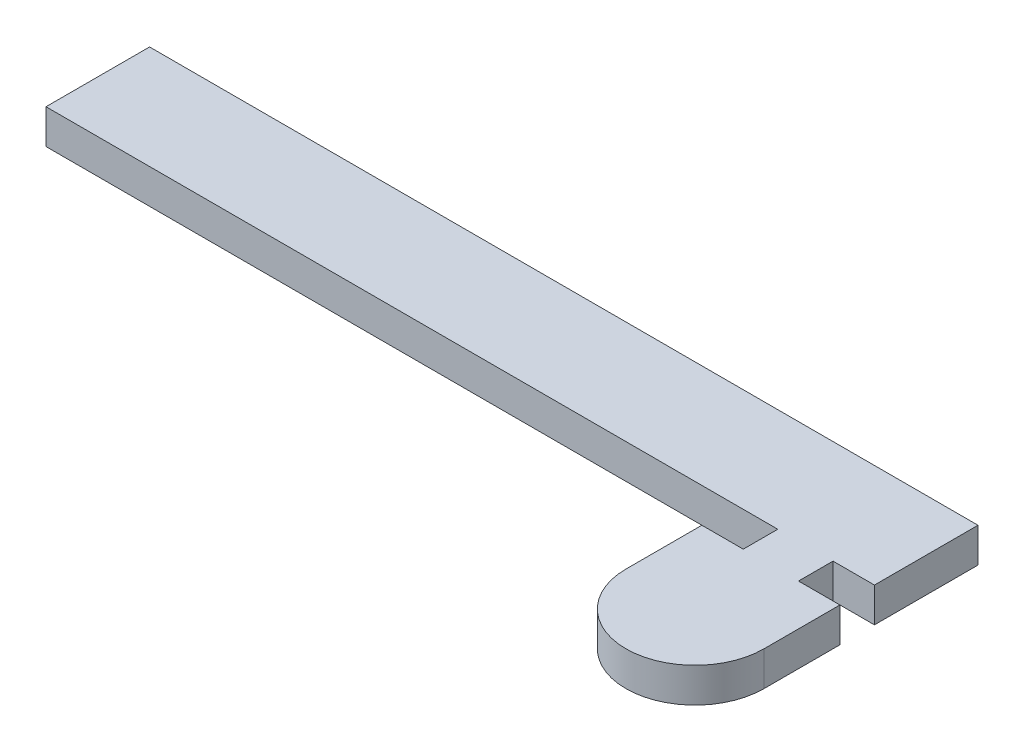
ISO-10303-21;
HEADER;
FILE_DESCRIPTION(('STEP AP214'),'2;1');
FILE_NAME('part.step','',(''),(''),'','','');
FILE_SCHEMA(('AUTOMOTIVE_DESIGN { 1 0 10303 214 1 1 1 1 }'));
ENDSEC;
DATA;
#1=APPLICATION_CONTEXT('core data for automotive mechanical design processes');
#2=APPLICATION_PROTOCOL_DEFINITION('international standard','automotive_design',2000,#1);
#3=PRODUCT_CONTEXT('',#1,'mechanical');
#4=PRODUCT('Part','Part','',(#3));
#5=PRODUCT_RELATED_PRODUCT_CATEGORY('part','',(#4));
#6=PRODUCT_DEFINITION_FORMATION('','',#4);
#7=PRODUCT_DEFINITION_CONTEXT('part definition',#1,'design');
#8=PRODUCT_DEFINITION('design','',#6,#7);
#9=PRODUCT_DEFINITION_SHAPE('','',#8);
#10=(LENGTH_UNIT() NAMED_UNIT(*) SI_UNIT(.MILLI.,.METRE.));
#11=(NAMED_UNIT(*) PLANE_ANGLE_UNIT() SI_UNIT($,.RADIAN.));
#12=(NAMED_UNIT(*) SI_UNIT($,.STERADIAN.) SOLID_ANGLE_UNIT());
#13=UNCERTAINTY_MEASURE_WITH_UNIT(LENGTH_MEASURE(1.E-05),#10,'distance_accuracy_value','');
#14=(GEOMETRIC_REPRESENTATION_CONTEXT(3) GLOBAL_UNCERTAINTY_ASSIGNED_CONTEXT((#13)) GLOBAL_UNIT_ASSIGNED_CONTEXT((#10,
#11,#12)) REPRESENTATION_CONTEXT('',''));
#15=CARTESIAN_POINT('',(0.,0.,0.));
#16=DIRECTION('',(0.,0.,1.));
#17=DIRECTION('',(1.,0.,0.));
#18=AXIS2_PLACEMENT_3D('',#15,#16,#17);
#19=CARTESIAN_POINT('',(-37.8392780705383,5.,0.));
#20=DIRECTION('',(1.,0.,0.));
#21=DIRECTION('',(0.,0.,-1.));
#22=AXIS2_PLACEMENT_3D('',#19,#20,#21);
#23=PLANE('',#22);
#24=DIRECTION('',(0.,0.,1.));
#25=VECTOR('',#24,1.);
#26=CARTESIAN_POINT('',(-37.8392780705383,5.,0.));
#27=LINE('',#26,#25);
#28=CARTESIAN_POINT('',(-37.8392780705383,5.,10.269009949861));
#29=VERTEX_POINT('',#28);
#30=CARTESIAN_POINT('',(-37.8392780705383,5.,21.269009949861));
#31=VERTEX_POINT('',#30);
#32=EDGE_CURVE('E190',#29,#31,#27,.T.);
#33=ORIENTED_EDGE('',*,*,#32,.F.);
#34=DIRECTION('',(0.,1.,0.));
#35=VECTOR('',#34,1.);
#36=CARTESIAN_POINT('',(-37.8392780705383,-5.,10.269009949861));
#37=LINE('',#36,#35);
#38=CARTESIAN_POINT('',(-37.8392780705383,0.,10.269009949861));
#39=VERTEX_POINT('',#38);
#40=EDGE_CURVE('E183',#39,#29,#37,.T.);
#41=ORIENTED_EDGE('',*,*,#40,.F.);
#42=DIRECTION('',(0.,0.,1.));
#43=VECTOR('',#42,1.);
#44=CARTESIAN_POINT('',(-37.8392780705383,0.,0.));
#45=LINE('',#44,#43);
#46=CARTESIAN_POINT('',(-37.8392780705383,0.,21.269009949861));
#47=VERTEX_POINT('',#46);
#48=EDGE_CURVE('E187',#39,#47,#45,.T.);
#49=ORIENTED_EDGE('',*,*,#48,.T.);
#50=DIRECTION('',(0.,-1.,0.));
#51=VECTOR('',#50,1.);
#52=CARTESIAN_POINT('',(-37.8392780705383,5.,21.269009949861));
#53=LINE('',#52,#51);
#54=EDGE_CURVE('E206',#31,#47,#53,.T.);
#55=ORIENTED_EDGE('',*,*,#54,.F.);
#56=EDGE_LOOP('',(#33,#41,#49,#55));
#57=FACE_BOUND('',#56,.T.);
#58=ADVANCED_FACE('F35',(#57),#23,.F.);
#59=CARTESIAN_POINT('',(-27.8392780705383,5.,21.269009949861));
#60=DIRECTION('',(0.,-1.,0.));
#61=DIRECTION('',(0.,0.,-1.));
#62=AXIS2_PLACEMENT_3D('',#59,#60,#61);
#63=CYLINDRICAL_SURFACE('',#62,10.);
#64=CARTESIAN_POINT('',(-27.8392780705383,0.,21.269009949861));
#65=DIRECTION('',(0.,1.,0.));
#66=DIRECTION('',(0.,0.,1.));
#67=AXIS2_PLACEMENT_3D('',#64,#65,#66);
#68=CIRCLE('',#67,10.);
#69=CARTESIAN_POINT('',(-17.8392780705383,0.,21.269009949861));
#70=VERTEX_POINT('',#69);
#71=EDGE_CURVE('E200',#47,#70,#68,.T.);
#72=ORIENTED_EDGE('',*,*,#71,.T.);
#73=DIRECTION('',(0.,-1.,0.));
#74=VECTOR('',#73,1.);
#75=CARTESIAN_POINT('',(-17.8392780705383,5.,21.269009949861));
#76=LINE('',#75,#74);
#77=CARTESIAN_POINT('',(-17.8392780705383,5.,21.269009949861));
#78=VERTEX_POINT('',#77);
#79=EDGE_CURVE('E198',#78,#70,#76,.T.);
#80=ORIENTED_EDGE('',*,*,#79,.F.);
#81=CARTESIAN_POINT('',(-27.8392780705383,5.,21.269009949861));
#82=DIRECTION('',(0.,1.,0.));
#83=DIRECTION('',(0.,0.,1.));
#84=AXIS2_PLACEMENT_3D('',#81,#82,#83);
#85=CIRCLE('',#84,10.);
#86=EDGE_CURVE('E192',#31,#78,#85,.T.);
#87=ORIENTED_EDGE('',*,*,#86,.F.);
#88=ORIENTED_EDGE('',*,*,#54,.T.);
#89=EDGE_LOOP('',(#72,#80,#87,#88));
#90=FACE_BOUND('',#89,.T.);
#91=ADVANCED_FACE('F235',(#90),#63,.T.);
#92=CARTESIAN_POINT('',(-17.8392780705383,5.,0.));
#93=DIRECTION('',(1.,0.,0.));
#94=DIRECTION('',(0.,0.,-1.));
#95=AXIS2_PLACEMENT_3D('',#92,#93,#94);
#96=PLANE('',#95);
#97=DIRECTION('',(0.,1.,0.));
#98=VECTOR('',#97,1.);
#99=CARTESIAN_POINT('',(-17.8392780705383,-5.,10.269009949861));
#100=LINE('',#99,#98);
#101=CARTESIAN_POINT('',(-17.8392780705383,0.,10.269009949861));
#102=VERTEX_POINT('',#101);
#103=CARTESIAN_POINT('',(-17.8392780705383,5.,10.269009949861));
#104=VERTEX_POINT('',#103);
#105=EDGE_CURVE('E174',#102,#104,#100,.T.);
#106=ORIENTED_EDGE('',*,*,#105,.T.);
#107=DIRECTION('',(0.,0.,1.));
#108=VECTOR('',#107,1.);
#109=CARTESIAN_POINT('',(-17.8392780705383,5.,0.));
#110=LINE('',#109,#108);
#111=EDGE_CURVE('E196',#104,#78,#110,.T.);
#112=ORIENTED_EDGE('',*,*,#111,.T.);
#113=ORIENTED_EDGE('',*,*,#79,.T.);
#114=DIRECTION('',(0.,0.,1.));
#115=VECTOR('',#114,1.);
#116=CARTESIAN_POINT('',(-17.8392780705383,0.,0.));
#117=LINE('',#116,#115);
#118=EDGE_CURVE('E193',#102,#70,#117,.T.);
#119=ORIENTED_EDGE('',*,*,#118,.F.);
#120=EDGE_LOOP('',(#106,#112,#113,#119));
#121=FACE_BOUND('',#120,.T.);
#122=ADVANCED_FACE('F228',(#121),#96,.T.);
#123=CARTESIAN_POINT('',(0.,5.,0.));
#124=DIRECTION('',(0.,1.,0.));
#125=DIRECTION('',(0.,0.,1.));
#126=AXIS2_PLACEMENT_3D('',#123,#124,#125);
#127=PLANE('',#126);
#128=DIRECTION('',(1.,0.,0.));
#129=VECTOR('',#128,1.);
#130=CARTESIAN_POINT('',(-17.8392780705383,5.,10.269009949861));
#131=LINE('',#130,#129);
#132=CARTESIAN_POINT('',(-23.8392780705383,5.,10.269009949861));
#133=VERTEX_POINT('',#132);
#134=EDGE_CURVE('E171',#133,#104,#131,.T.);
#135=ORIENTED_EDGE('',*,*,#134,.F.);
#136=DIRECTION('',(0.,0.,1.));
#137=VECTOR('',#136,1.);
#138=CARTESIAN_POINT('',(-23.8392780705383,5.,5.26900994986101));
#139=LINE('',#138,#137);
#140=CARTESIAN_POINT('',(-23.8392780705383,5.,5.26900994986101));
#141=VERTEX_POINT('',#140);
#142=EDGE_CURVE('E165',#141,#133,#139,.T.);
#143=ORIENTED_EDGE('',*,*,#142,.F.);
#144=DIRECTION('',(-1.,0.,0.));
#145=VECTOR('',#144,1.);
#146=CARTESIAN_POINT('',(-17.8392780705383,5.,5.26900994986101));
#147=LINE('',#146,#145);
#148=CARTESIAN_POINT('',(-17.8392780705383,5.,5.26900994986101));
#149=VERTEX_POINT('',#148);
#150=EDGE_CURVE('E149',#149,#141,#147,.T.);
#151=ORIENTED_EDGE('',*,*,#150,.F.);
#152=DIRECTION('',(0.,0.,-1.));
#153=VECTOR('',#152,1.);
#154=CARTESIAN_POINT('',(-17.8392780705383,5.,5.26900994986101));
#155=LINE('',#154,#153);
#156=CARTESIAN_POINT('',(-17.8392780705383,5.,-9.73099005013899));
#157=VERTEX_POINT('',#156);
#158=EDGE_CURVE('E158',#149,#157,#155,.T.);
#159=ORIENTED_EDGE('',*,*,#158,.T.);
#160=DIRECTION('',(-1.,0.,0.));
#161=VECTOR('',#160,1.);
#162=CARTESIAN_POINT('',(-17.8392780705383,5.,-9.73099005013899));
#163=LINE('',#162,#161);
#164=CARTESIAN_POINT('',(-137.839278070538,5.,-9.73099005013897));
#165=VERTEX_POINT('',#164);
#166=EDGE_CURVE('E128',#157,#165,#163,.T.);
#167=ORIENTED_EDGE('',*,*,#166,.T.);
#168=DIRECTION('',(0.,0.,1.));
#169=VECTOR('',#168,1.);
#170=CARTESIAN_POINT('',(-137.839278070538,5.,-9.73099005013897));
#171=LINE('',#170,#169);
#172=CARTESIAN_POINT('',(-137.839278070538,5.,5.26900994986103));
#173=VERTEX_POINT('',#172);
#174=EDGE_CURVE('E161',#165,#173,#171,.T.);
#175=ORIENTED_EDGE('',*,*,#174,.T.);
#176=CARTESIAN_POINT('',(-31.8392780705383,5.,5.26900994986101));
#177=VERTEX_POINT('',#176);
#178=EDGE_CURVE('E152',#177,#173,#147,.T.);
#179=ORIENTED_EDGE('',*,*,#178,.F.);
#180=DIRECTION('',(0.,0.,-1.));
#181=VECTOR('',#180,1.);
#182=CARTESIAN_POINT('',(-31.8392780705383,5.,5.26900994986102));
#183=LINE('',#182,#181);
#184=CARTESIAN_POINT('',(-31.8392780705383,5.,10.269009949861));
#185=VERTEX_POINT('',#184);
#186=EDGE_CURVE('E181',#185,#177,#183,.T.);
#187=ORIENTED_EDGE('',*,*,#186,.F.);
#188=DIRECTION('',(1.,0.,0.));
#189=VECTOR('',#188,1.);
#190=CARTESIAN_POINT('',(-37.8392780705383,5.,10.269009949861));
#191=LINE('',#190,#189);
#192=EDGE_CURVE('E177',#29,#185,#191,.T.);
#193=ORIENTED_EDGE('',*,*,#192,.F.);
#194=ORIENTED_EDGE('',*,*,#32,.T.);
#195=ORIENTED_EDGE('',*,*,#86,.T.);
#196=ORIENTED_EDGE('',*,*,#111,.F.);
#197=EDGE_LOOP('',(#135,#143,#151,#159,#167,#175,#179,#187,#193,#194,#195,#196));
#198=FACE_BOUND('',#197,.T.);
#199=ADVANCED_FACE('F223',(#198),#127,.T.);
#200=CARTESIAN_POINT('',(0.,0.,0.));
#201=DIRECTION('',(0.,1.,0.));
#202=DIRECTION('',(0.,0.,1.));
#203=AXIS2_PLACEMENT_3D('',#200,#201,#202);
#204=PLANE('',#203);
#205=DIRECTION('',(0.,0.,1.));
#206=VECTOR('',#205,1.);
#207=CARTESIAN_POINT('',(-23.8392780705383,0.,0.));
#208=LINE('',#207,#206);
#209=CARTESIAN_POINT('',(-23.8392780705383,0.,5.26900994986101));
#210=VERTEX_POINT('',#209);
#211=CARTESIAN_POINT('',(-23.8392780705383,0.,10.269009949861));
#212=VERTEX_POINT('',#211);
#213=EDGE_CURVE('E42',#210,#212,#208,.T.);
#214=ORIENTED_EDGE('',*,*,#213,.T.);
#215=DIRECTION('',(1.,0.,0.));
#216=VECTOR('',#215,1.);
#217=CARTESIAN_POINT('',(0.,0.,10.269009949861));
#218=LINE('',#217,#216);
#219=EDGE_CURVE('E11',#212,#102,#218,.T.);
#220=ORIENTED_EDGE('',*,*,#219,.T.);
#221=ORIENTED_EDGE('',*,*,#118,.T.);
#222=ORIENTED_EDGE('',*,*,#71,.F.);
#223=ORIENTED_EDGE('',*,*,#48,.F.);
#224=DIRECTION('',(1.,0.,0.));
#225=VECTOR('',#224,1.);
#226=CARTESIAN_POINT('',(0.,0.,10.269009949861));
#227=LINE('',#226,#225);
#228=CARTESIAN_POINT('',(-31.8392780705383,0.,10.269009949861));
#229=VERTEX_POINT('',#228);
#230=EDGE_CURVE('E209',#39,#229,#227,.T.);
#231=ORIENTED_EDGE('',*,*,#230,.T.);
#232=DIRECTION('',(0.,0.,-1.));
#233=VECTOR('',#232,1.);
#234=CARTESIAN_POINT('',(-31.8392780705383,0.,0.));
#235=LINE('',#234,#233);
#236=CARTESIAN_POINT('',(-31.8392780705383,0.,5.26900994986102));
#237=VERTEX_POINT('',#236);
#238=EDGE_CURVE('E212',#229,#237,#235,.T.);
#239=ORIENTED_EDGE('',*,*,#238,.T.);
#240=DIRECTION('',(-1.,0.,0.));
#241=VECTOR('',#240,1.);
#242=CARTESIAN_POINT('',(-17.8392780705383,0.,5.26900994986101));
#243=LINE('',#242,#241);
#244=CARTESIAN_POINT('',(-137.839278070538,0.,5.26900994986103));
#245=VERTEX_POINT('',#244);
#246=EDGE_CURVE('E156',#237,#245,#243,.T.);
#247=ORIENTED_EDGE('',*,*,#246,.T.);
#248=DIRECTION('',(0.,0.,1.));
#249=VECTOR('',#248,1.);
#250=CARTESIAN_POINT('',(-137.839278070538,0.,-9.73099005013897));
#251=LINE('',#250,#249);
#252=CARTESIAN_POINT('',(-137.839278070538,0.,-9.73099005013897));
#253=VERTEX_POINT('',#252);
#254=EDGE_CURVE('E144',#253,#245,#251,.T.);
#255=ORIENTED_EDGE('',*,*,#254,.F.);
#256=DIRECTION('',(-1.,0.,0.));
#257=VECTOR('',#256,1.);
#258=CARTESIAN_POINT('',(-17.8392780705383,0.,-9.73099005013899));
#259=LINE('',#258,#257);
#260=CARTESIAN_POINT('',(-17.8392780705383,0.,-9.73099005013899));
#261=VERTEX_POINT('',#260);
#262=EDGE_CURVE('E126',#261,#253,#259,.T.);
#263=ORIENTED_EDGE('',*,*,#262,.F.);
#264=DIRECTION('',(0.,0.,-1.));
#265=VECTOR('',#264,1.);
#266=CARTESIAN_POINT('',(-17.8392780705383,0.,5.26900994986101));
#267=LINE('',#266,#265);
#268=CARTESIAN_POINT('',(-17.8392780705383,0.,5.26900994986101));
#269=VERTEX_POINT('',#268);
#270=EDGE_CURVE('E142',#269,#261,#267,.T.);
#271=ORIENTED_EDGE('',*,*,#270,.F.);
#272=EDGE_CURVE('E134',#269,#210,#243,.T.);
#273=ORIENTED_EDGE('',*,*,#272,.T.);
#274=EDGE_LOOP('',(#214,#220,#221,#222,#223,#231,#239,#247,#255,#263,#271,#273));
#275=FACE_BOUND('',#274,.T.);
#276=ADVANCED_FACE('F140',(#275),#204,.F.);
#277=CARTESIAN_POINT('',(-31.8392780705383,-5.,5.26900994986102));
#278=DIRECTION('',(1.,0.,0.));
#279=DIRECTION('',(0.,0.,-1.));
#280=AXIS2_PLACEMENT_3D('',#277,#278,#279);
#281=PLANE('',#280);
#282=DIRECTION('',(0.,1.,0.));
#283=VECTOR('',#282,1.);
#284=CARTESIAN_POINT('',(-31.8392780705383,-5.,10.269009949861));
#285=LINE('',#284,#283);
#286=EDGE_CURVE('E57',#229,#185,#285,.T.);
#287=ORIENTED_EDGE('',*,*,#286,.T.);
#288=ORIENTED_EDGE('',*,*,#186,.T.);
#289=DIRECTION('',(0.,1.,0.));
#290=VECTOR('',#289,1.);
#291=CARTESIAN_POINT('',(-31.8392780705383,-5.,5.26900994986102));
#292=LINE('',#291,#290);
#293=EDGE_CURVE('E184',#237,#177,#292,.T.);
#294=ORIENTED_EDGE('',*,*,#293,.F.);
#295=ORIENTED_EDGE('',*,*,#238,.F.);
#296=EDGE_LOOP('',(#287,#288,#294,#295));
#297=FACE_BOUND('',#296,.T.);
#298=ADVANCED_FACE('F244',(#297),#281,.F.);
#299=CARTESIAN_POINT('',(-37.8392780705383,-5.,10.269009949861));
#300=DIRECTION('',(0.,0.,1.));
#301=DIRECTION('',(1.,0.,0.));
#302=AXIS2_PLACEMENT_3D('',#299,#300,#301);
#303=PLANE('',#302);
#304=ORIENTED_EDGE('',*,*,#40,.T.);
#305=ORIENTED_EDGE('',*,*,#192,.T.);
#306=ORIENTED_EDGE('',*,*,#286,.F.);
#307=ORIENTED_EDGE('',*,*,#230,.F.);
#308=EDGE_LOOP('',(#304,#305,#306,#307));
#309=FACE_BOUND('',#308,.T.);
#310=ADVANCED_FACE('F240',(#309),#303,.F.);
#311=CARTESIAN_POINT('',(-17.8392780705383,-5.,10.269009949861));
#312=DIRECTION('',(0.,0.,1.));
#313=DIRECTION('',(1.,0.,0.));
#314=AXIS2_PLACEMENT_3D('',#311,#312,#313);
#315=PLANE('',#314);
#316=DIRECTION('',(0.,1.,0.));
#317=VECTOR('',#316,1.);
#318=CARTESIAN_POINT('',(-23.8392780705383,-5.,10.269009949861));
#319=LINE('',#318,#317);
#320=EDGE_CURVE('E49',#212,#133,#319,.T.);
#321=ORIENTED_EDGE('',*,*,#320,.T.);
#322=ORIENTED_EDGE('',*,*,#134,.T.);
#323=ORIENTED_EDGE('',*,*,#105,.F.);
#324=ORIENTED_EDGE('',*,*,#219,.F.);
#325=EDGE_LOOP('',(#321,#322,#323,#324));
#326=FACE_BOUND('',#325,.T.);
#327=ADVANCED_FACE('F226',(#326),#315,.F.);
#328=CARTESIAN_POINT('',(-23.8392780705383,-5.,5.26900994986101));
#329=DIRECTION('',(-1.,0.,0.));
#330=DIRECTION('',(0.,0.,1.));
#331=AXIS2_PLACEMENT_3D('',#328,#329,#330);
#332=PLANE('',#331);
#333=DIRECTION('',(0.,1.,0.));
#334=VECTOR('',#333,1.);
#335=CARTESIAN_POINT('',(-23.8392780705383,-5.,5.26900994986101));
#336=LINE('',#335,#334);
#337=EDGE_CURVE('E173',#210,#141,#336,.T.);
#338=ORIENTED_EDGE('',*,*,#337,.T.);
#339=ORIENTED_EDGE('',*,*,#142,.T.);
#340=ORIENTED_EDGE('',*,*,#320,.F.);
#341=ORIENTED_EDGE('',*,*,#213,.F.);
#342=EDGE_LOOP('',(#338,#339,#340,#341));
#343=FACE_BOUND('',#342,.T.);
#344=ADVANCED_FACE('F216',(#343),#332,.F.);
#345=CARTESIAN_POINT('',(-17.8392780705383,0.,5.26900994986101));
#346=DIRECTION('',(0.,0.,-1.));
#347=DIRECTION('',(-1.,0.,0.));
#348=AXIS2_PLACEMENT_3D('',#345,#346,#347);
#349=PLANE('',#348);
#350=ORIENTED_EDGE('',*,*,#246,.F.);
#351=ORIENTED_EDGE('',*,*,#293,.T.);
#352=ORIENTED_EDGE('',*,*,#178,.T.);
#353=DIRECTION('',(0.,1.,0.));
#354=VECTOR('',#353,1.);
#355=CARTESIAN_POINT('',(-137.839278070538,0.,5.26900994986103));
#356=LINE('',#355,#354);
#357=EDGE_CURVE('E166',#245,#173,#356,.T.);
#358=ORIENTED_EDGE('',*,*,#357,.F.);
#359=EDGE_LOOP('',(#350,#351,#352,#358));
#360=FACE_BOUND('',#359,.T.);
#361=ADVANCED_FACE('F247',(#360),#349,.F.);
#362=CARTESIAN_POINT('',(-17.8392780705383,0.,5.26900994986101));
#363=DIRECTION('',(1.,0.,0.));
#364=DIRECTION('',(0.,0.,-1.));
#365=AXIS2_PLACEMENT_3D('',#362,#363,#364);
#366=PLANE('',#365);
#367=ORIENTED_EDGE('',*,*,#158,.F.);
#368=DIRECTION('',(0.,1.,0.));
#369=VECTOR('',#368,1.);
#370=CARTESIAN_POINT('',(-17.8392780705383,0.,5.26900994986101));
#371=LINE('',#370,#369);
#372=EDGE_CURVE('E147',#269,#149,#371,.T.);
#373=ORIENTED_EDGE('',*,*,#372,.F.);
#374=ORIENTED_EDGE('',*,*,#270,.T.);
#375=DIRECTION('',(0.,1.,0.));
#376=VECTOR('',#375,1.);
#377=CARTESIAN_POINT('',(-17.8392780705383,0.,-9.73099005013899));
#378=LINE('',#377,#376);
#379=EDGE_CURVE('E123',#261,#157,#378,.T.);
#380=ORIENTED_EDGE('',*,*,#379,.T.);
#381=EDGE_LOOP('',(#367,#373,#374,#380));
#382=FACE_BOUND('',#381,.T.);
#383=ADVANCED_FACE('F146',(#382),#366,.T.);
#384=ORIENTED_EDGE('',*,*,#337,.F.);
#385=ORIENTED_EDGE('',*,*,#272,.F.);
#386=ORIENTED_EDGE('',*,*,#372,.T.);
#387=ORIENTED_EDGE('',*,*,#150,.T.);
#388=EDGE_LOOP('',(#384,#385,#386,#387));
#389=FACE_BOUND('',#388,.T.);
#390=ADVANCED_FACE('F219',(#389),#349,.F.);
#391=CARTESIAN_POINT('',(-137.839278070538,0.,-9.73099005013897));
#392=DIRECTION('',(-1.,0.,0.));
#393=DIRECTION('',(0.,0.,1.));
#394=AXIS2_PLACEMENT_3D('',#391,#392,#393);
#395=PLANE('',#394);
#396=ORIENTED_EDGE('',*,*,#174,.F.);
#397=DIRECTION('',(0.,1.,0.));
#398=VECTOR('',#397,1.);
#399=CARTESIAN_POINT('',(-137.839278070538,0.,-9.73099005013897));
#400=LINE('',#399,#398);
#401=EDGE_CURVE('E133',#253,#165,#400,.T.);
#402=ORIENTED_EDGE('',*,*,#401,.F.);
#403=ORIENTED_EDGE('',*,*,#254,.T.);
#404=ORIENTED_EDGE('',*,*,#357,.T.);
#405=EDGE_LOOP('',(#396,#402,#403,#404));
#406=FACE_BOUND('',#405,.T.);
#407=ADVANCED_FACE('F251',(#406),#395,.T.);
#408=CARTESIAN_POINT('',(-17.8392780705383,0.,-9.73099005013899));
#409=DIRECTION('',(0.,0.,-1.));
#410=DIRECTION('',(-1.,0.,0.));
#411=AXIS2_PLACEMENT_3D('',#408,#409,#410);
#412=PLANE('',#411);
#413=ORIENTED_EDGE('',*,*,#166,.F.);
#414=ORIENTED_EDGE('',*,*,#379,.F.);
#415=ORIENTED_EDGE('',*,*,#262,.T.);
#416=ORIENTED_EDGE('',*,*,#401,.T.);
#417=EDGE_LOOP('',(#413,#414,#415,#416));
#418=FACE_BOUND('',#417,.T.);
#419=ADVANCED_FACE('F125',(#418),#412,.T.);
#420=CLOSED_SHELL('',(#58,#91,#122,#199,#276,#298,#310,#327,#344,#361,#383,#390,#407,#419));
#421=MANIFOLD_SOLID_BREP('B2',#420);
#422=ADVANCED_BREP_SHAPE_REPRESENTATION('',(#18,#421),#14);
#423=SHAPE_DEFINITION_REPRESENTATION(#9,#422);
ENDSEC;
END-ISO-10303-21;
